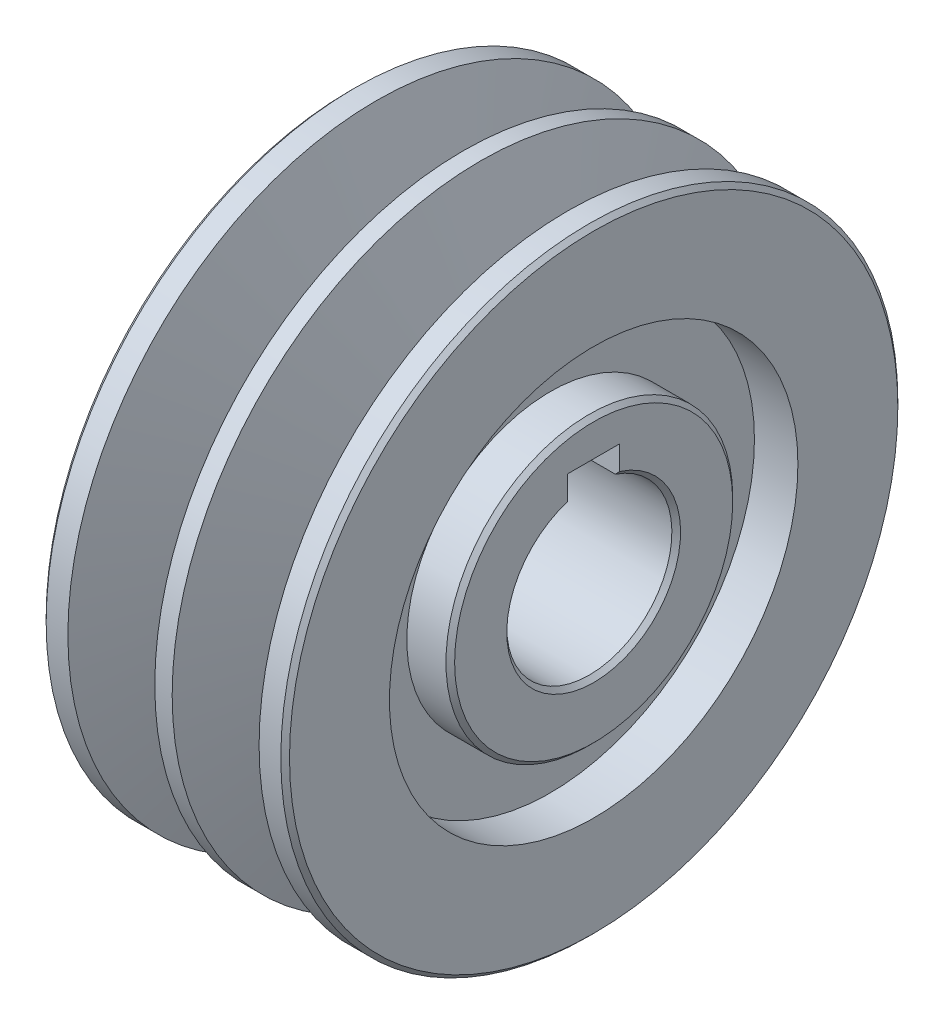
ISO-10303-21;
HEADER;
FILE_DESCRIPTION(('STEP AP214'),'2;1');
FILE_NAME('part.step','',(''),(''),'','','');
FILE_SCHEMA(('AUTOMOTIVE_DESIGN { 1 0 10303 214 1 1 1 1 }'));
ENDSEC;
DATA;
#1=APPLICATION_CONTEXT('core data for automotive mechanical design processes');
#2=APPLICATION_PROTOCOL_DEFINITION('international standard','automotive_design',2000,#1);
#3=PRODUCT_CONTEXT('',#1,'mechanical');
#4=PRODUCT('Part','Part','',(#3));
#5=PRODUCT_RELATED_PRODUCT_CATEGORY('part','',(#4));
#6=PRODUCT_DEFINITION_FORMATION('','',#4);
#7=PRODUCT_DEFINITION_CONTEXT('part definition',#1,'design');
#8=PRODUCT_DEFINITION('design','',#6,#7);
#9=PRODUCT_DEFINITION_SHAPE('','',#8);
#10=(LENGTH_UNIT() NAMED_UNIT(*) SI_UNIT(.MILLI.,.METRE.));
#11=(NAMED_UNIT(*) PLANE_ANGLE_UNIT() SI_UNIT($,.RADIAN.));
#12=(NAMED_UNIT(*) SI_UNIT($,.STERADIAN.) SOLID_ANGLE_UNIT());
#13=UNCERTAINTY_MEASURE_WITH_UNIT(LENGTH_MEASURE(1.E-05),#10,'distance_accuracy_value','');
#14=(GEOMETRIC_REPRESENTATION_CONTEXT(3) GLOBAL_UNCERTAINTY_ASSIGNED_CONTEXT((#13)) GLOBAL_UNIT_ASSIGNED_CONTEXT((#10,
#11,#12)) REPRESENTATION_CONTEXT('',''));
#15=CARTESIAN_POINT('',(0.,0.,0.));
#16=DIRECTION('',(0.,0.,1.));
#17=DIRECTION('',(1.,0.,0.));
#18=AXIS2_PLACEMENT_3D('',#15,#16,#17);
#19=CARTESIAN_POINT('',(0.,0.,0.));
#20=DIRECTION('',(1.,0.,0.));
#21=DIRECTION('',(0.,0.,-1.));
#22=AXIS2_PLACEMENT_3D('',#19,#20,#21);
#23=CYLINDRICAL_SURFACE('',#22,35.5);
#24=CARTESIAN_POINT('',(-13.5,0.,0.));
#25=DIRECTION('',(-1.,0.,0.));
#26=DIRECTION('',(0.,0.,1.));
#27=AXIS2_PLACEMENT_3D('',#24,#25,#26);
#28=CIRCLE('',#27,35.5);
#29=CARTESIAN_POINT('',(-13.5,0.,35.5));
#30=VERTEX_POINT('',#29);
#31=EDGE_CURVE('E341',#30,#30,#28,.F.);
#32=ORIENTED_EDGE('',*,*,#31,.T.);
#33=EDGE_LOOP('',(#32));
#34=FACE_BOUND('',#33,.T.);
#35=CARTESIAN_POINT('',(-11.,0.,0.));
#36=DIRECTION('',(1.,0.,0.));
#37=DIRECTION('',(0.,0.,-1.));
#38=AXIS2_PLACEMENT_3D('',#35,#36,#37);
#39=CIRCLE('',#38,35.5);
#40=CARTESIAN_POINT('',(-11.,0.,-35.5));
#41=VERTEX_POINT('',#40);
#42=EDGE_CURVE('E628',#41,#41,#39,.T.);
#43=ORIENTED_EDGE('',*,*,#42,.F.);
#44=EDGE_LOOP('',(#43));
#45=FACE_BOUND('',#44,.T.);
#46=ADVANCED_FACE('F41',(#34,#45),#23,.T.);
#47=CARTESIAN_POINT('',(-7.94269318541343,0.,0.));
#48=DIRECTION('',(-1.,0.,0.));
#49=DIRECTION('',(0.,0.,1.));
#50=AXIS2_PLACEMENT_3D('',#47,#48,#49);
#51=CONICAL_SURFACE('',#50,25.5,1.27409035395586);
#52=ORIENTED_EDGE('',*,*,#42,.T.);
#53=EDGE_LOOP('',(#52));
#54=FACE_BOUND('',#53,.T.);
#55=CARTESIAN_POINT('',(-7.94269318541343,0.,0.));
#56=DIRECTION('',(1.,0.,0.));
#57=DIRECTION('',(0.,0.,-1.));
#58=AXIS2_PLACEMENT_3D('',#55,#56,#57);
#59=CIRCLE('',#58,25.5);
#60=CARTESIAN_POINT('',(-7.94269318541343,0.,-25.5));
#61=VERTEX_POINT('',#60);
#62=EDGE_CURVE('E624',#61,#61,#59,.T.);
#63=ORIENTED_EDGE('',*,*,#62,.F.);
#64=EDGE_LOOP('',(#63));
#65=FACE_BOUND('',#64,.T.);
#66=ADVANCED_FACE('F209',(#54,#65),#51,.T.);
#67=CARTESIAN_POINT('',(0.,0.,0.));
#68=DIRECTION('',(1.,0.,0.));
#69=DIRECTION('',(0.,0.,-1.));
#70=AXIS2_PLACEMENT_3D('',#67,#68,#69);
#71=CYLINDRICAL_SURFACE('',#70,25.5);
#72=ORIENTED_EDGE('',*,*,#62,.T.);
#73=EDGE_LOOP('',(#72));
#74=FACE_BOUND('',#73,.T.);
#75=CARTESIAN_POINT('',(-4.05730681458657,0.,0.));
#76=DIRECTION('',(1.,0.,0.));
#77=DIRECTION('',(0.,0.,-1.));
#78=AXIS2_PLACEMENT_3D('',#75,#76,#77);
#79=CIRCLE('',#78,25.5);
#80=CARTESIAN_POINT('',(-4.05730681458657,0.,-25.5));
#81=VERTEX_POINT('',#80);
#82=EDGE_CURVE('E620',#81,#81,#79,.T.);
#83=ORIENTED_EDGE('',*,*,#82,.F.);
#84=EDGE_LOOP('',(#83));
#85=FACE_BOUND('',#84,.T.);
#86=ADVANCED_FACE('F214',(#74,#85),#71,.T.);
#87=CARTESIAN_POINT('',(-1.,0.,0.));
#88=DIRECTION('',(1.,0.,0.));
#89=DIRECTION('',(0.,0.,-1.));
#90=AXIS2_PLACEMENT_3D('',#87,#88,#89);
#91=CONICAL_SURFACE('',#90,35.5,1.27409035395586);
#92=ORIENTED_EDGE('',*,*,#82,.T.);
#93=EDGE_LOOP('',(#92));
#94=FACE_BOUND('',#93,.T.);
#95=CARTESIAN_POINT('',(-1.,0.,0.));
#96=DIRECTION('',(1.,0.,0.));
#97=DIRECTION('',(0.,0.,-1.));
#98=AXIS2_PLACEMENT_3D('',#95,#96,#97);
#99=CIRCLE('',#98,35.5);
#100=CARTESIAN_POINT('',(-1.,0.,-35.5));
#101=VERTEX_POINT('',#100);
#102=EDGE_CURVE('E616',#101,#101,#99,.T.);
#103=ORIENTED_EDGE('',*,*,#102,.F.);
#104=EDGE_LOOP('',(#103));
#105=FACE_BOUND('',#104,.T.);
#106=ADVANCED_FACE('F222',(#94,#105),#91,.T.);
#107=CARTESIAN_POINT('',(0.,0.,0.));
#108=DIRECTION('',(1.,0.,0.));
#109=DIRECTION('',(0.,0.,-1.));
#110=AXIS2_PLACEMENT_3D('',#107,#108,#109);
#111=CYLINDRICAL_SURFACE('',#110,35.5);
#112=ORIENTED_EDGE('',*,*,#102,.T.);
#113=EDGE_LOOP('',(#112));
#114=FACE_BOUND('',#113,.T.);
#115=CARTESIAN_POINT('',(1.,0.,0.));
#116=DIRECTION('',(1.,0.,0.));
#117=DIRECTION('',(0.,0.,-1.));
#118=AXIS2_PLACEMENT_3D('',#115,#116,#117);
#119=CIRCLE('',#118,35.5);
#120=CARTESIAN_POINT('',(1.,0.,-35.5));
#121=VERTEX_POINT('',#120);
#122=EDGE_CURVE('E612',#121,#121,#119,.T.);
#123=ORIENTED_EDGE('',*,*,#122,.F.);
#124=EDGE_LOOP('',(#123));
#125=FACE_BOUND('',#124,.T.);
#126=ADVANCED_FACE('F226',(#114,#125),#111,.T.);
#127=CARTESIAN_POINT('',(4.05730681458657,0.,0.));
#128=DIRECTION('',(-1.,0.,0.));
#129=DIRECTION('',(0.,0.,1.));
#130=AXIS2_PLACEMENT_3D('',#127,#128,#129);
#131=CONICAL_SURFACE('',#130,25.5,1.27409035395586);
#132=ORIENTED_EDGE('',*,*,#122,.T.);
#133=EDGE_LOOP('',(#132));
#134=FACE_BOUND('',#133,.T.);
#135=CARTESIAN_POINT('',(4.05730681458657,0.,0.));
#136=DIRECTION('',(1.,0.,0.));
#137=DIRECTION('',(0.,0.,-1.));
#138=AXIS2_PLACEMENT_3D('',#135,#136,#137);
#139=CIRCLE('',#138,25.5);
#140=CARTESIAN_POINT('',(4.05730681458657,0.,-25.5));
#141=VERTEX_POINT('',#140);
#142=EDGE_CURVE('E608',#141,#141,#139,.T.);
#143=ORIENTED_EDGE('',*,*,#142,.F.);
#144=EDGE_LOOP('',(#143));
#145=FACE_BOUND('',#144,.T.);
#146=ADVANCED_FACE('F230',(#134,#145),#131,.T.);
#147=CARTESIAN_POINT('',(0.,0.,0.));
#148=DIRECTION('',(1.,0.,0.));
#149=DIRECTION('',(0.,0.,-1.));
#150=AXIS2_PLACEMENT_3D('',#147,#148,#149);
#151=CYLINDRICAL_SURFACE('',#150,25.5);
#152=ORIENTED_EDGE('',*,*,#142,.T.);
#153=EDGE_LOOP('',(#152));
#154=FACE_BOUND('',#153,.T.);
#155=CARTESIAN_POINT('',(7.94269318541343,0.,0.));
#156=DIRECTION('',(1.,0.,0.));
#157=DIRECTION('',(0.,0.,-1.));
#158=AXIS2_PLACEMENT_3D('',#155,#156,#157);
#159=CIRCLE('',#158,25.5);
#160=CARTESIAN_POINT('',(7.94269318541343,0.,-25.5));
#161=VERTEX_POINT('',#160);
#162=EDGE_CURVE('E601',#161,#161,#159,.T.);
#163=ORIENTED_EDGE('',*,*,#162,.F.);
#164=EDGE_LOOP('',(#163));
#165=FACE_BOUND('',#164,.T.);
#166=ADVANCED_FACE('F234',(#154,#165),#151,.T.);
#167=CARTESIAN_POINT('',(11.,0.,0.));
#168=DIRECTION('',(1.,0.,0.));
#169=DIRECTION('',(0.,0.,-1.));
#170=AXIS2_PLACEMENT_3D('',#167,#168,#169);
#171=CONICAL_SURFACE('',#170,35.5,1.27409035395586);
#172=ORIENTED_EDGE('',*,*,#162,.T.);
#173=EDGE_LOOP('',(#172));
#174=FACE_BOUND('',#173,.T.);
#175=CARTESIAN_POINT('',(11.,0.,0.));
#176=DIRECTION('',(1.,0.,0.));
#177=DIRECTION('',(0.,0.,-1.));
#178=AXIS2_PLACEMENT_3D('',#175,#176,#177);
#179=CIRCLE('',#178,35.5);
#180=CARTESIAN_POINT('',(11.,0.,-35.5));
#181=VERTEX_POINT('',#180);
#182=EDGE_CURVE('E596',#181,#181,#179,.T.);
#183=ORIENTED_EDGE('',*,*,#182,.F.);
#184=EDGE_LOOP('',(#183));
#185=FACE_BOUND('',#184,.T.);
#186=ADVANCED_FACE('F238',(#174,#185),#171,.T.);
#187=CARTESIAN_POINT('',(0.,0.,0.));
#188=DIRECTION('',(1.,0.,0.));
#189=DIRECTION('',(0.,0.,-1.));
#190=AXIS2_PLACEMENT_3D('',#187,#188,#189);
#191=CYLINDRICAL_SURFACE('',#190,35.5);
#192=CARTESIAN_POINT('',(13.5,0.,0.));
#193=DIRECTION('',(1.,0.,0.));
#194=DIRECTION('',(0.,0.,-1.));
#195=AXIS2_PLACEMENT_3D('',#192,#193,#194);
#196=CIRCLE('',#195,35.5);
#197=CARTESIAN_POINT('',(13.5,0.,-35.5));
#198=VERTEX_POINT('',#197);
#199=EDGE_CURVE('E323',#198,#198,#196,.F.);
#200=ORIENTED_EDGE('',*,*,#199,.T.);
#201=EDGE_LOOP('',(#200));
#202=FACE_BOUND('',#201,.T.);
#203=ORIENTED_EDGE('',*,*,#182,.T.);
#204=EDGE_LOOP('',(#203));
#205=FACE_BOUND('',#204,.T.);
#206=ADVANCED_FACE('F242',(#202,#205),#191,.T.);
#207=CARTESIAN_POINT('',(14.,0.,-35.5));
#208=DIRECTION('',(1.,0.,0.));
#209=DIRECTION('',(0.,0.,-1.));
#210=AXIS2_PLACEMENT_3D('',#207,#208,#209);
#211=PLANE('',#210);
#212=CARTESIAN_POINT('',(14.,0.,0.));
#213=DIRECTION('',(1.,0.,0.));
#214=DIRECTION('',(0.,0.,-1.));
#215=AXIS2_PLACEMENT_3D('',#212,#213,#214);
#216=CIRCLE('',#215,35.);
#217=CARTESIAN_POINT('',(14.,0.,-35.));
#218=VERTEX_POINT('',#217);
#219=EDGE_CURVE('E330',#218,#218,#216,.T.);
#220=ORIENTED_EDGE('',*,*,#219,.T.);
#221=EDGE_LOOP('',(#220));
#222=FACE_BOUND('',#221,.T.);
#223=CARTESIAN_POINT('',(14.,0.,0.));
#224=DIRECTION('',(1.,0.,0.));
#225=DIRECTION('',(0.,0.,-1.));
#226=AXIS2_PLACEMENT_3D('',#223,#224,#225);
#227=CIRCLE('',#226,23.5);
#228=CARTESIAN_POINT('',(14.,0.,-23.5));
#229=VERTEX_POINT('',#228);
#230=EDGE_CURVE('E594',#229,#229,#227,.T.);
#231=ORIENTED_EDGE('',*,*,#230,.F.);
#232=EDGE_LOOP('',(#231));
#233=FACE_BOUND('',#232,.T.);
#234=ADVANCED_FACE('F246',(#222,#233),#211,.T.);
#235=CARTESIAN_POINT('',(0.,0.,0.));
#236=DIRECTION('',(1.,0.,0.));
#237=DIRECTION('',(0.,0.,-1.));
#238=AXIS2_PLACEMENT_3D('',#235,#236,#237);
#239=CYLINDRICAL_SURFACE('',#238,23.5);
#240=ORIENTED_EDGE('',*,*,#230,.T.);
#241=EDGE_LOOP('',(#240));
#242=FACE_BOUND('',#241,.T.);
#243=CARTESIAN_POINT('',(9.,0.,0.));
#244=DIRECTION('',(1.,0.,0.));
#245=DIRECTION('',(0.,0.,-1.));
#246=AXIS2_PLACEMENT_3D('',#243,#244,#245);
#247=CIRCLE('',#246,23.5);
#248=CARTESIAN_POINT('',(9.,0.,-23.5));
#249=VERTEX_POINT('',#248);
#250=EDGE_CURVE('E360',#249,#249,#247,.T.);
#251=ORIENTED_EDGE('',*,*,#250,.F.);
#252=EDGE_LOOP('',(#251));
#253=FACE_BOUND('',#252,.T.);
#254=ADVANCED_FACE('F250',(#242,#253),#239,.F.);
#255=CARTESIAN_POINT('',(9.,0.,-23.5));
#256=DIRECTION('',(1.,0.,0.));
#257=DIRECTION('',(0.,0.,-1.));
#258=AXIS2_PLACEMENT_3D('',#255,#256,#257);
#259=PLANE('',#258);
#260=ORIENTED_EDGE('',*,*,#250,.T.);
#261=EDGE_LOOP('',(#260));
#262=FACE_BOUND('',#261,.T.);
#263=CARTESIAN_POINT('',(9.,0.,0.));
#264=DIRECTION('',(1.,0.,0.));
#265=DIRECTION('',(0.,0.,-1.));
#266=AXIS2_PLACEMENT_3D('',#263,#264,#265);
#267=CIRCLE('',#266,16.5);
#268=CARTESIAN_POINT('',(9.,0.,-16.5));
#269=VERTEX_POINT('',#268);
#270=EDGE_CURVE('E357',#269,#269,#267,.T.);
#271=ORIENTED_EDGE('',*,*,#270,.F.);
#272=EDGE_LOOP('',(#271));
#273=FACE_BOUND('',#272,.T.);
#274=ADVANCED_FACE('F254',(#262,#273),#259,.T.);
#275=CARTESIAN_POINT('',(0.,0.,0.));
#276=DIRECTION('',(1.,0.,0.));
#277=DIRECTION('',(0.,0.,-1.));
#278=AXIS2_PLACEMENT_3D('',#275,#276,#277);
#279=CYLINDRICAL_SURFACE('',#278,16.5);
#280=CARTESIAN_POINT('',(13.5,0.,0.));
#281=DIRECTION('',(1.,0.,0.));
#282=DIRECTION('',(0.,0.,-1.));
#283=AXIS2_PLACEMENT_3D('',#280,#281,#282);
#284=CIRCLE('',#283,16.5);
#285=CARTESIAN_POINT('',(13.5,0.,-16.5));
#286=VERTEX_POINT('',#285);
#287=EDGE_CURVE('E577',#286,#286,#284,.F.);
#288=ORIENTED_EDGE('',*,*,#287,.T.);
#289=EDGE_LOOP('',(#288));
#290=FACE_BOUND('',#289,.T.);
#291=ORIENTED_EDGE('',*,*,#270,.T.);
#292=EDGE_LOOP('',(#291));
#293=FACE_BOUND('',#292,.T.);
#294=ADVANCED_FACE('F258',(#290,#293),#279,.T.);
#295=CARTESIAN_POINT('',(14.,0.,-16.5));
#296=DIRECTION('',(1.,0.,0.));
#297=DIRECTION('',(0.,0.,-1.));
#298=AXIS2_PLACEMENT_3D('',#295,#296,#297);
#299=PLANE('',#298);
#300=DIRECTION('',(0.,-1.,0.));
#301=VECTOR('',#300,1.);
#302=CARTESIAN_POINT('',(14.,12.3,3.));
#303=LINE('',#302,#301);
#304=CARTESIAN_POINT('',(14.,12.3,3.));
#305=VERTEX_POINT('',#304);
#306=CARTESIAN_POINT('',(14.,9.53939201416943,3.));
#307=VERTEX_POINT('',#306);
#308=EDGE_CURVE('E124',#305,#307,#303,.T.);
#309=ORIENTED_EDGE('',*,*,#308,.F.);
#310=DIRECTION('',(0.,0.,1.));
#311=VECTOR('',#310,1.);
#312=CARTESIAN_POINT('',(14.,12.3,3.));
#313=LINE('',#312,#311);
#314=CARTESIAN_POINT('',(14.,12.3,-3.));
#315=VERTEX_POINT('',#314);
#316=EDGE_CURVE('E127',#315,#305,#313,.T.);
#317=ORIENTED_EDGE('',*,*,#316,.F.);
#318=DIRECTION('',(0.,1.,0.));
#319=VECTOR('',#318,1.);
#320=CARTESIAN_POINT('',(14.,12.3,-3.));
#321=LINE('',#320,#319);
#322=CARTESIAN_POINT('',(14.,9.53939201416943,-3.));
#323=VERTEX_POINT('',#322);
#324=EDGE_CURVE('E102',#323,#315,#321,.T.);
#325=ORIENTED_EDGE('',*,*,#324,.F.);
#326=CARTESIAN_POINT('',(14.,0.,0.));
#327=DIRECTION('',(1.,0.,0.));
#328=DIRECTION('',(0.,0.,-1.));
#329=AXIS2_PLACEMENT_3D('',#326,#327,#328);
#330=CIRCLE('',#329,9.99999999999998);
#331=EDGE_CURVE('E572',#323,#307,#330,.F.);
#332=ORIENTED_EDGE('',*,*,#331,.T.);
#333=EDGE_LOOP('',(#309,#317,#325,#332));
#334=FACE_BOUND('',#333,.T.);
#335=CARTESIAN_POINT('',(14.,0.,0.));
#336=DIRECTION('',(1.,0.,0.));
#337=DIRECTION('',(0.,0.,-1.));
#338=AXIS2_PLACEMENT_3D('',#335,#336,#337);
#339=CIRCLE('',#338,16.);
#340=CARTESIAN_POINT('',(14.,0.,-16.));
#341=VERTEX_POINT('',#340);
#342=EDGE_CURVE('E578',#341,#341,#339,.T.);
#343=ORIENTED_EDGE('',*,*,#342,.T.);
#344=EDGE_LOOP('',(#343));
#345=FACE_BOUND('',#344,.T.);
#346=ADVANCED_FACE('F262',(#334,#345),#299,.T.);
#347=CARTESIAN_POINT('',(0.,0.,0.));
#348=DIRECTION('',(1.,0.,0.));
#349=DIRECTION('',(0.,0.,-1.));
#350=AXIS2_PLACEMENT_3D('',#347,#348,#349);
#351=CYLINDRICAL_SURFACE('',#350,9.5);
#352=DIRECTION('',(1.,0.,0.));
#353=VECTOR('',#352,1.);
#354=CARTESIAN_POINT('',(0.,9.01387818865997,3.));
#355=LINE('',#354,#353);
#356=CARTESIAN_POINT('',(13.5,9.01387818865997,3.));
#357=VERTEX_POINT('',#356);
#358=CARTESIAN_POINT('',(-13.5,9.01387818865997,3.));
#359=VERTEX_POINT('',#358);
#360=EDGE_CURVE('E150',#357,#359,#355,.F.);
#361=ORIENTED_EDGE('',*,*,#360,.F.);
#362=CARTESIAN_POINT('',(13.5,0.,0.));
#363=DIRECTION('',(1.,0.,0.));
#364=DIRECTION('',(0.,0.,-1.));
#365=AXIS2_PLACEMENT_3D('',#362,#363,#364);
#366=CIRCLE('',#365,9.5);
#367=CARTESIAN_POINT('',(13.5,9.01387818865997,-3.));
#368=VERTEX_POINT('',#367);
#369=EDGE_CURVE('E573',#357,#368,#366,.T.);
#370=ORIENTED_EDGE('',*,*,#369,.T.);
#371=DIRECTION('',(1.,0.,0.));
#372=VECTOR('',#371,1.);
#373=CARTESIAN_POINT('',(0.,9.01387818865997,-3.));
#374=LINE('',#373,#372);
#375=CARTESIAN_POINT('',(-13.5,9.01387818865997,-3.));
#376=VERTEX_POINT('',#375);
#377=EDGE_CURVE('E137',#376,#368,#374,.T.);
#378=ORIENTED_EDGE('',*,*,#377,.F.);
#379=CARTESIAN_POINT('',(-13.5,0.,0.));
#380=DIRECTION('',(-1.,0.,0.));
#381=DIRECTION('',(0.,0.,1.));
#382=AXIS2_PLACEMENT_3D('',#379,#380,#381);
#383=CIRCLE('',#382,9.5);
#384=EDGE_CURVE('E337',#376,#359,#383,.T.);
#385=ORIENTED_EDGE('',*,*,#384,.T.);
#386=EDGE_LOOP('',(#361,#370,#378,#385));
#387=FACE_BOUND('',#386,.T.);
#388=ADVANCED_FACE('F266',(#387),#351,.F.);
#389=CARTESIAN_POINT('',(-14.,0.,-9.5));
#390=DIRECTION('',(-1.,0.,0.));
#391=DIRECTION('',(0.,0.,1.));
#392=AXIS2_PLACEMENT_3D('',#389,#390,#391);
#393=PLANE('',#392);
#394=DIRECTION('',(0.,-1.,0.));
#395=VECTOR('',#394,1.);
#396=CARTESIAN_POINT('',(-14.,12.3,3.));
#397=LINE('',#396,#395);
#398=CARTESIAN_POINT('',(-14.,12.3,3.));
#399=VERTEX_POINT('',#398);
#400=CARTESIAN_POINT('',(-14.,9.53939201416948,3.));
#401=VERTEX_POINT('',#400);
#402=EDGE_CURVE('E108',#399,#401,#397,.T.);
#403=ORIENTED_EDGE('',*,*,#402,.T.);
#404=CARTESIAN_POINT('',(-14.,0.,0.));
#405=DIRECTION('',(-1.,0.,0.));
#406=DIRECTION('',(0.,0.,1.));
#407=AXIS2_PLACEMENT_3D('',#404,#405,#406);
#408=CIRCLE('',#407,10.);
#409=CARTESIAN_POINT('',(-14.,9.53939201416948,-3.));
#410=VERTEX_POINT('',#409);
#411=EDGE_CURVE('E122',#401,#410,#408,.F.);
#412=ORIENTED_EDGE('',*,*,#411,.T.);
#413=DIRECTION('',(0.,1.,0.));
#414=VECTOR('',#413,1.);
#415=CARTESIAN_POINT('',(-14.,7.43298087794207,-3.));
#416=LINE('',#415,#414);
#417=CARTESIAN_POINT('',(-14.,12.3,-3.));
#418=VERTEX_POINT('',#417);
#419=EDGE_CURVE('E63',#410,#418,#416,.T.);
#420=ORIENTED_EDGE('',*,*,#419,.T.);
#421=DIRECTION('',(0.,0.,1.));
#422=VECTOR('',#421,1.);
#423=CARTESIAN_POINT('',(-14.,12.3,3.));
#424=LINE('',#423,#422);
#425=EDGE_CURVE('E111',#418,#399,#424,.T.);
#426=ORIENTED_EDGE('',*,*,#425,.T.);
#427=EDGE_LOOP('',(#403,#412,#420,#426));
#428=FACE_BOUND('',#427,.T.);
#429=CARTESIAN_POINT('',(-14.,0.,0.));
#430=DIRECTION('',(-1.,0.,0.));
#431=DIRECTION('',(0.,0.,1.));
#432=AXIS2_PLACEMENT_3D('',#429,#430,#431);
#433=CIRCLE('',#432,16.);
#434=CARTESIAN_POINT('',(-14.,0.,16.));
#435=VERTEX_POINT('',#434);
#436=EDGE_CURVE('E327',#435,#435,#433,.T.);
#437=ORIENTED_EDGE('',*,*,#436,.T.);
#438=EDGE_LOOP('',(#437));
#439=FACE_BOUND('',#438,.T.);
#440=ADVANCED_FACE('F119',(#428,#439),#393,.T.);
#441=CARTESIAN_POINT('',(0.,0.,0.));
#442=DIRECTION('',(1.,0.,0.));
#443=DIRECTION('',(0.,0.,-1.));
#444=AXIS2_PLACEMENT_3D('',#441,#442,#443);
#445=CYLINDRICAL_SURFACE('',#444,16.5);
#446=CARTESIAN_POINT('',(-10.,0.,0.));
#447=DIRECTION('',(-1.,0.,0.));
#448=DIRECTION('',(0.,0.,1.));
#449=AXIS2_PLACEMENT_3D('',#446,#447,#448);
#450=CIRCLE('',#449,16.5);
#451=CARTESIAN_POINT('',(-10.,0.,16.5));
#452=VERTEX_POINT('',#451);
#453=EDGE_CURVE('E170',#452,#452,#450,.T.);
#454=ORIENTED_EDGE('',*,*,#453,.T.);
#455=EDGE_LOOP('',(#454));
#456=FACE_BOUND('',#455,.T.);
#457=CARTESIAN_POINT('',(-13.5,0.,0.));
#458=DIRECTION('',(-1.,0.,0.));
#459=DIRECTION('',(0.,0.,1.));
#460=AXIS2_PLACEMENT_3D('',#457,#458,#459);
#461=CIRCLE('',#460,16.5);
#462=CARTESIAN_POINT('',(-13.5,0.,16.5));
#463=VERTEX_POINT('',#462);
#464=EDGE_CURVE('E320',#463,#463,#461,.F.);
#465=ORIENTED_EDGE('',*,*,#464,.T.);
#466=EDGE_LOOP('',(#465));
#467=FACE_BOUND('',#466,.T.);
#468=ADVANCED_FACE('F273',(#456,#467),#445,.T.);
#469=CARTESIAN_POINT('',(-9.,0.,-16.5));
#470=DIRECTION('',(-1.,0.,0.));
#471=DIRECTION('',(0.,0.,1.));
#472=AXIS2_PLACEMENT_3D('',#469,#470,#471);
#473=PLANE('',#472);
#474=CARTESIAN_POINT('',(-9.,0.,0.));
#475=DIRECTION('',(-1.,0.,0.));
#476=DIRECTION('',(0.,0.,1.));
#477=AXIS2_PLACEMENT_3D('',#474,#475,#476);
#478=CIRCLE('',#477,22.5);
#479=CARTESIAN_POINT('',(-9.,0.,22.5));
#480=VERTEX_POINT('',#479);
#481=EDGE_CURVE('E308',#480,#480,#478,.T.);
#482=ORIENTED_EDGE('',*,*,#481,.T.);
#483=EDGE_LOOP('',(#482));
#484=FACE_BOUND('',#483,.T.);
#485=CARTESIAN_POINT('',(-9.,0.,0.));
#486=DIRECTION('',(-1.,0.,0.));
#487=DIRECTION('',(0.,0.,1.));
#488=AXIS2_PLACEMENT_3D('',#485,#486,#487);
#489=CIRCLE('',#488,17.5);
#490=CARTESIAN_POINT('',(-9.,0.,17.5));
#491=VERTEX_POINT('',#490);
#492=EDGE_CURVE('E299',#491,#491,#489,.F.);
#493=ORIENTED_EDGE('',*,*,#492,.T.);
#494=EDGE_LOOP('',(#493));
#495=FACE_BOUND('',#494,.T.);
#496=ADVANCED_FACE('F276',(#484,#495),#473,.T.);
#497=CARTESIAN_POINT('',(0.,0.,0.));
#498=DIRECTION('',(1.,0.,0.));
#499=DIRECTION('',(0.,0.,-1.));
#500=AXIS2_PLACEMENT_3D('',#497,#498,#499);
#501=CYLINDRICAL_SURFACE('',#500,23.5);
#502=CARTESIAN_POINT('',(-10.,0.,0.));
#503=DIRECTION('',(-1.,0.,0.));
#504=DIRECTION('',(0.,0.,1.));
#505=AXIS2_PLACEMENT_3D('',#502,#503,#504);
#506=CIRCLE('',#505,23.5);
#507=CARTESIAN_POINT('',(-10.,0.,23.5));
#508=VERTEX_POINT('',#507);
#509=EDGE_CURVE('E290',#508,#508,#506,.F.);
#510=ORIENTED_EDGE('',*,*,#509,.T.);
#511=EDGE_LOOP('',(#510));
#512=FACE_BOUND('',#511,.T.);
#513=CARTESIAN_POINT('',(-13.5,0.,0.));
#514=DIRECTION('',(-1.,0.,0.));
#515=DIRECTION('',(0.,0.,1.));
#516=AXIS2_PLACEMENT_3D('',#513,#514,#515);
#517=CIRCLE('',#516,23.5);
#518=CARTESIAN_POINT('',(-13.5,0.,23.5));
#519=VERTEX_POINT('',#518);
#520=EDGE_CURVE('E293',#519,#519,#517,.T.);
#521=ORIENTED_EDGE('',*,*,#520,.T.);
#522=EDGE_LOOP('',(#521));
#523=FACE_BOUND('',#522,.T.);
#524=ADVANCED_FACE('F279',(#512,#523),#501,.F.);
#525=CARTESIAN_POINT('',(-14.,0.,-35.5));
#526=DIRECTION('',(-1.,0.,0.));
#527=DIRECTION('',(0.,0.,1.));
#528=AXIS2_PLACEMENT_3D('',#525,#526,#527);
#529=PLANE('',#528);
#530=CARTESIAN_POINT('',(-14.,0.,0.));
#531=DIRECTION('',(-1.,0.,0.));
#532=DIRECTION('',(0.,0.,1.));
#533=AXIS2_PLACEMENT_3D('',#530,#531,#532);
#534=CIRCLE('',#533,35.);
#535=CARTESIAN_POINT('',(-14.,0.,35.));
#536=VERTEX_POINT('',#535);
#537=EDGE_CURVE('E295',#536,#536,#534,.T.);
#538=ORIENTED_EDGE('',*,*,#537,.T.);
#539=EDGE_LOOP('',(#538));
#540=FACE_BOUND('',#539,.T.);
#541=CARTESIAN_POINT('',(-14.,0.,0.));
#542=DIRECTION('',(-1.,0.,0.));
#543=DIRECTION('',(0.,0.,1.));
#544=AXIS2_PLACEMENT_3D('',#541,#542,#543);
#545=CIRCLE('',#544,24.);
#546=CARTESIAN_POINT('',(-14.,0.,24.));
#547=VERTEX_POINT('',#546);
#548=EDGE_CURVE('E302',#547,#547,#545,.F.);
#549=ORIENTED_EDGE('',*,*,#548,.T.);
#550=EDGE_LOOP('',(#549));
#551=FACE_BOUND('',#550,.T.);
#552=ADVANCED_FACE('F161',(#540,#551),#529,.T.);
#553=CARTESIAN_POINT('',(13.5,0.,0.));
#554=DIRECTION('',(1.,0.,0.));
#555=DIRECTION('',(0.,0.,-1.));
#556=AXIS2_PLACEMENT_3D('',#553,#554,#555);
#557=CONICAL_SURFACE('',#556,9.5,0.785398163397429);
#558=CARTESIAN_POINT('',(16.6154604407613,12.2535644664077,3.));
#559=CARTESIAN_POINT('',(16.3733723666181,12.004323485741,3.));
#560=CARTESIAN_POINT('',(16.1314952465939,11.7548779371056,3.));
#561=CARTESIAN_POINT('',(15.6482603058921,11.2554843837296,3.));
#562=CARTESIAN_POINT('',(15.4069024852408,11.0055363789635,3.));
#563=CARTESIAN_POINT('',(14.6837905037315,10.2548365350653,3.));
#564=CARTESIAN_POINT('',(14.2029612291103,9.75319124935251,3.));
#565=CARTESIAN_POINT('',(13.4845860226208,8.99796166320799,3.));
#566=CARTESIAN_POINT('',(13.2455977314413,8.74574964438044,3.));
#567=CARTESIAN_POINT('',(12.7688667193426,8.24015420115851,3.));
#568=CARTESIAN_POINT('',(12.5311239882669,7.98677078634773,3.));
#569=CARTESIAN_POINT('',(12.0572388278039,7.4784735027146,3.));
#570=CARTESIAN_POINT('',(11.8210965207733,7.2235595196243,3.));
#571=CARTESIAN_POINT('',(11.4685147815183,6.83968309104933,3.));
#572=CARTESIAN_POINT('',(11.3512578648633,6.71147157411063,3.));
#573=CARTESIAN_POINT('',(11.1173892873714,6.45445985575204,3.));
#574=CARTESIAN_POINT('',(11.0007776311638,6.32565965012083,3.));
#575=CARTESIAN_POINT('',(10.8845395592387,6.19652200373114,3.));
#576=B_SPLINE_CURVE_WITH_KNOTS('',3,(#558,#559,#560,#561,#562,#563,#564,#565,#566,#567,#568,
#569,#570,#571,#572,#573,#574,#575),.UNSPECIFIED.,.F.,.F.,(4,2,2,2,2,2,2,2,4),(0.,
1.04237601534942,2.08475208353532,4.16934678025917,5.21171439559541,6.25407349799201,
7.2965114123713,7.81774490710185,8.33898213645327),.UNSPECIFIED.);
#577=EDGE_CURVE('E71',#307,#357,#576,.T.);
#578=ORIENTED_EDGE('',*,*,#577,.F.);
#579=ORIENTED_EDGE('',*,*,#331,.F.);
#580=CARTESIAN_POINT('',(10.8845395592387,6.19652200373113,-3.));
#581=CARTESIAN_POINT('',(11.0007776311637,6.32565965012083,-3.));
#582=CARTESIAN_POINT('',(11.1173892873714,6.45445985575203,-3.));
#583=CARTESIAN_POINT('',(11.3512578648633,6.71147157411062,-3.));
#584=CARTESIAN_POINT('',(11.4685147815183,6.83968309104933,-3.));
#585=CARTESIAN_POINT('',(11.8210965207733,7.2235595196243,-3.));
#586=CARTESIAN_POINT('',(12.0572388278039,7.47847350271459,-3.));
#587=CARTESIAN_POINT('',(12.5311239882669,7.98677078634772,-3.));
#588=CARTESIAN_POINT('',(12.7688667193426,8.2401542011585,-3.));
#589=CARTESIAN_POINT('',(13.2455977314413,8.74574964438044,-3.));
#590=CARTESIAN_POINT('',(13.4845860226208,8.99796166320798,-3.));
#591=CARTESIAN_POINT('',(14.2029612291103,9.75319124935251,-3.));
#592=CARTESIAN_POINT('',(14.6837905037315,10.2548365350653,-3.));
#593=CARTESIAN_POINT('',(15.4069024852408,11.0055363789635,-3.));
#594=CARTESIAN_POINT('',(15.6482603058921,11.2554843837296,-3.));
#595=CARTESIAN_POINT('',(16.1314952465939,11.7548779371056,-3.));
#596=CARTESIAN_POINT('',(16.3733723666181,12.004323485741,-3.));
#597=CARTESIAN_POINT('',(16.6154604407613,12.2535644664077,-3.));
#598=B_SPLINE_CURVE_WITH_KNOTS('',3,(#580,#581,#582,#583,#584,#585,#586,#587,#588,#589,#590,
#591,#592,#593,#594,#595,#596,#597),.UNSPECIFIED.,.F.,.F.,(4,2,2,2,2,2,2,2,4),(0.,
0.521237229351425,1.04247072408197,2.08490863846127,3.12726774085787,4.16963535619412,
6.25423005291796,7.29660612110387,8.33898213645328),.UNSPECIFIED.);
#599=EDGE_CURVE('E141',#368,#323,#598,.T.);
#600=ORIENTED_EDGE('',*,*,#599,.F.);
#601=ORIENTED_EDGE('',*,*,#369,.F.);
#602=EDGE_LOOP('',(#578,#579,#600,#601));
#603=FACE_BOUND('',#602,.T.);
#604=ADVANCED_FACE('F153',(#603),#557,.F.);
#605=CARTESIAN_POINT('',(14.,0.,0.));
#606=DIRECTION('',(-1.,0.,0.));
#607=DIRECTION('',(0.,0.,1.));
#608=AXIS2_PLACEMENT_3D('',#605,#606,#607);
#609=CONICAL_SURFACE('',#608,16.,0.785398163397445);
#610=ORIENTED_EDGE('',*,*,#287,.F.);
#611=EDGE_LOOP('',(#610));
#612=FACE_BOUND('',#611,.T.);
#613=ORIENTED_EDGE('',*,*,#342,.F.);
#614=EDGE_LOOP('',(#613));
#615=FACE_BOUND('',#614,.T.);
#616=ADVANCED_FACE('F434',(#612,#615),#609,.T.);
#617=CARTESIAN_POINT('',(14.,0.,0.));
#618=DIRECTION('',(-1.,0.,0.));
#619=DIRECTION('',(0.,0.,1.));
#620=AXIS2_PLACEMENT_3D('',#617,#618,#619);
#621=CONICAL_SURFACE('',#620,35.,0.785398163397448);
#622=ORIENTED_EDGE('',*,*,#199,.F.);
#623=EDGE_LOOP('',(#622));
#624=FACE_BOUND('',#623,.T.);
#625=ORIENTED_EDGE('',*,*,#219,.F.);
#626=EDGE_LOOP('',(#625));
#627=FACE_BOUND('',#626,.T.);
#628=ADVANCED_FACE('F425',(#624,#627),#621,.T.);
#629=CARTESIAN_POINT('',(-13.5,0.,0.));
#630=DIRECTION('',(1.,0.,0.));
#631=DIRECTION('',(0.,0.,-1.));
#632=AXIS2_PLACEMENT_3D('',#629,#630,#631);
#633=CONICAL_SURFACE('',#632,16.5,0.785398163397441);
#634=ORIENTED_EDGE('',*,*,#436,.F.);
#635=EDGE_LOOP('',(#634));
#636=FACE_BOUND('',#635,.T.);
#637=ORIENTED_EDGE('',*,*,#464,.F.);
#638=EDGE_LOOP('',(#637));
#639=FACE_BOUND('',#638,.T.);
#640=ADVANCED_FACE('F183',(#636,#639),#633,.T.);
#641=CARTESIAN_POINT('',(-14.,0.,0.));
#642=DIRECTION('',(-1.,0.,0.));
#643=DIRECTION('',(0.,0.,1.));
#644=AXIS2_PLACEMENT_3D('',#641,#642,#643);
#645=CONICAL_SURFACE('',#644,10.,0.785398163397453);
#646=CARTESIAN_POINT('',(-10.8845395592387,6.19652200373095,3.));
#647=CARTESIAN_POINT('',(-11.0007776311637,6.32565965012066,3.));
#648=CARTESIAN_POINT('',(-11.1173892873714,6.45445985575187,3.));
#649=CARTESIAN_POINT('',(-11.3512578648632,6.71147157411048,3.));
#650=CARTESIAN_POINT('',(-11.4685147815182,6.83968309104919,3.));
#651=CARTESIAN_POINT('',(-11.8210965207733,7.22355951962419,3.));
#652=CARTESIAN_POINT('',(-12.0572388278038,7.47847350271449,3.));
#653=CARTESIAN_POINT('',(-12.5311239882669,7.98677078634766,3.));
#654=CARTESIAN_POINT('',(-12.7688667193426,8.24015420115846,3.));
#655=CARTESIAN_POINT('',(-13.2455977314413,8.74574964438043,3.));
#656=CARTESIAN_POINT('',(-13.4845860226207,8.99796166320799,3.));
#657=CARTESIAN_POINT('',(-14.2029612291103,9.75319124935257,3.));
#658=CARTESIAN_POINT('',(-14.6837905037315,10.2548365350654,3.));
#659=CARTESIAN_POINT('',(-15.4069024852409,11.0055363789636,3.));
#660=CARTESIAN_POINT('',(-15.6482603058921,11.2554843837297,3.));
#661=CARTESIAN_POINT('',(-16.1314952465939,11.7548779371058,3.));
#662=CARTESIAN_POINT('',(-16.3733723666182,12.0043234857412,3.));
#663=CARTESIAN_POINT('',(-16.6154604407613,12.253564466408,3.));
#664=B_SPLINE_CURVE_WITH_KNOTS('',3,(#646,#647,#648,#649,#650,#651,#652,#653,#654,#655,#656,
#657,#658,#659,#660,#661,#662,#663),.UNSPECIFIED.,.F.,.F.,(4,2,2,2,2,2,2,2,4),(0.,
0.521237229351449,1.04247072408202,2.08490863846136,3.127267740858,4.1696353561943,
6.25423005291823,7.29660612110419,8.33898213645365),.UNSPECIFIED.);
#665=EDGE_CURVE('E11',#359,#401,#664,.T.);
#666=ORIENTED_EDGE('',*,*,#665,.F.);
#667=ORIENTED_EDGE('',*,*,#384,.F.);
#668=CARTESIAN_POINT('',(-16.6154604407613,12.2535644664079,-3.));
#669=CARTESIAN_POINT('',(-16.3733723666182,12.0043234857412,-3.));
#670=CARTESIAN_POINT('',(-16.1314952465939,11.7548779371058,-3.));
#671=CARTESIAN_POINT('',(-15.6482603058921,11.2554843837297,-3.));
#672=CARTESIAN_POINT('',(-15.4069024852408,11.0055363789636,-3.));
#673=CARTESIAN_POINT('',(-14.6837905037315,10.2548365350654,-3.));
#674=CARTESIAN_POINT('',(-14.2029612291103,9.75319124935256,-3.));
#675=CARTESIAN_POINT('',(-13.4845860226207,8.99796166320798,-3.));
#676=CARTESIAN_POINT('',(-13.2455977314413,8.74574964438042,-3.));
#677=CARTESIAN_POINT('',(-12.7688667193426,8.24015420115845,-3.));
#678=CARTESIAN_POINT('',(-12.5311239882669,7.98677078634765,-3.));
#679=CARTESIAN_POINT('',(-12.0572388278038,7.47847350271449,-3.));
#680=CARTESIAN_POINT('',(-11.8210965207733,7.22355951962418,-3.));
#681=CARTESIAN_POINT('',(-11.4685147815182,6.83968309104918,-3.));
#682=CARTESIAN_POINT('',(-11.3512578648632,6.71147157411047,-3.));
#683=CARTESIAN_POINT('',(-11.1173892873714,6.45445985575186,-3.));
#684=CARTESIAN_POINT('',(-11.0007776311637,6.32565965012064,-3.));
#685=CARTESIAN_POINT('',(-10.8845395592386,6.19652200373094,-3.));
#686=B_SPLINE_CURVE_WITH_KNOTS('',3,(#668,#669,#670,#671,#672,#673,#674,#675,#676,#677,#678,
#679,#680,#681,#682,#683,#684,#685),.UNSPECIFIED.,.F.,.F.,(4,2,2,2,2,2,2,2,4),(0.,
1.04237601534946,2.08475208353542,4.16934678025935,5.21171439559565,6.25407349799229,
7.29651141237163,7.8177449071022,8.33898213645365),.UNSPECIFIED.);
#687=EDGE_CURVE('E56',#410,#376,#686,.T.);
#688=ORIENTED_EDGE('',*,*,#687,.F.);
#689=ORIENTED_EDGE('',*,*,#411,.F.);
#690=EDGE_LOOP('',(#666,#667,#688,#689));
#691=FACE_BOUND('',#690,.T.);
#692=ADVANCED_FACE('F173',(#691),#645,.F.);
#693=CARTESIAN_POINT('',(-13.5,0.,0.));
#694=DIRECTION('',(1.,0.,0.));
#695=DIRECTION('',(0.,0.,-1.));
#696=AXIS2_PLACEMENT_3D('',#693,#694,#695);
#697=CONICAL_SURFACE('',#696,35.5,0.785398163397448);
#698=ORIENTED_EDGE('',*,*,#537,.F.);
#699=EDGE_LOOP('',(#698));
#700=FACE_BOUND('',#699,.T.);
#701=ORIENTED_EDGE('',*,*,#31,.F.);
#702=EDGE_LOOP('',(#701));
#703=FACE_BOUND('',#702,.T.);
#704=ADVANCED_FACE('F182',(#700,#703),#697,.T.);
#705=CARTESIAN_POINT('',(-14.,0.,0.));
#706=DIRECTION('',(-1.,0.,0.));
#707=DIRECTION('',(0.,0.,1.));
#708=AXIS2_PLACEMENT_3D('',#705,#706,#707);
#709=CONICAL_SURFACE('',#708,24.,0.785398163397448);
#710=ORIENTED_EDGE('',*,*,#520,.F.);
#711=EDGE_LOOP('',(#710));
#712=FACE_BOUND('',#711,.T.);
#713=ORIENTED_EDGE('',*,*,#548,.F.);
#714=EDGE_LOOP('',(#713));
#715=FACE_BOUND('',#714,.T.);
#716=ADVANCED_FACE('F192',(#712,#715),#709,.F.);
#717=CARTESIAN_POINT('',(-10.,0.,0.));
#718=DIRECTION('',(-1.,0.,0.));
#719=DIRECTION('',(0.,0.,1.));
#720=AXIS2_PLACEMENT_3D('',#717,#718,#719);
#721=TOROIDAL_SURFACE('',#720,22.5,1.);
#722=ORIENTED_EDGE('',*,*,#481,.F.);
#723=EDGE_LOOP('',(#722));
#724=FACE_BOUND('',#723,.T.);
#725=ORIENTED_EDGE('',*,*,#509,.F.);
#726=EDGE_LOOP('',(#725));
#727=FACE_BOUND('',#726,.T.);
#728=ADVANCED_FACE('F197',(#724,#727),#721,.F.);
#729=CARTESIAN_POINT('',(-10.,0.,0.));
#730=DIRECTION('',(-1.,0.,0.));
#731=DIRECTION('',(0.,0.,1.));
#732=AXIS2_PLACEMENT_3D('',#729,#730,#731);
#733=TOROIDAL_SURFACE('',#732,17.5,1.);
#734=ORIENTED_EDGE('',*,*,#453,.F.);
#735=EDGE_LOOP('',(#734));
#736=FACE_BOUND('',#735,.T.);
#737=ORIENTED_EDGE('',*,*,#492,.F.);
#738=EDGE_LOOP('',(#737));
#739=FACE_BOUND('',#738,.T.);
#740=ADVANCED_FACE('F43',(#736,#739),#733,.F.);
#741=CARTESIAN_POINT('',(-14.,12.3,3.));
#742=DIRECTION('',(0.,0.,1.));
#743=DIRECTION('',(0.,-1.,0.));
#744=AXIS2_PLACEMENT_3D('',#741,#742,#743);
#745=PLANE('',#744);
#746=ORIENTED_EDGE('',*,*,#577,.T.);
#747=ORIENTED_EDGE('',*,*,#360,.T.);
#748=ORIENTED_EDGE('',*,*,#665,.T.);
#749=ORIENTED_EDGE('',*,*,#402,.F.);
#750=DIRECTION('',(1.,0.,0.));
#751=VECTOR('',#750,1.);
#752=CARTESIAN_POINT('',(-14.,12.3,3.));
#753=LINE('',#752,#751);
#754=EDGE_CURVE('E107',#399,#305,#753,.T.);
#755=ORIENTED_EDGE('',*,*,#754,.T.);
#756=ORIENTED_EDGE('',*,*,#308,.T.);
#757=EDGE_LOOP('',(#746,#747,#748,#749,#755,#756));
#758=FACE_BOUND('',#757,.T.);
#759=ADVANCED_FACE('F204',(#758),#745,.F.);
#760=CARTESIAN_POINT('',(-14.,12.3,3.));
#761=DIRECTION('',(0.,1.,0.));
#762=DIRECTION('',(0.,0.,1.));
#763=AXIS2_PLACEMENT_3D('',#760,#761,#762);
#764=PLANE('',#763);
#765=ORIENTED_EDGE('',*,*,#316,.T.);
#766=ORIENTED_EDGE('',*,*,#754,.F.);
#767=ORIENTED_EDGE('',*,*,#425,.F.);
#768=DIRECTION('',(1.,0.,0.));
#769=VECTOR('',#768,1.);
#770=CARTESIAN_POINT('',(-14.,12.3,-3.));
#771=LINE('',#770,#769);
#772=EDGE_CURVE('E98',#418,#315,#771,.T.);
#773=ORIENTED_EDGE('',*,*,#772,.T.);
#774=EDGE_LOOP('',(#765,#766,#767,#773));
#775=FACE_BOUND('',#774,.T.);
#776=ADVANCED_FACE('F112',(#775),#764,.F.);
#777=CARTESIAN_POINT('',(-14.,12.3,-3.));
#778=DIRECTION('',(0.,0.,-1.));
#779=DIRECTION('',(0.,1.,0.));
#780=AXIS2_PLACEMENT_3D('',#777,#778,#779);
#781=PLANE('',#780);
#782=ORIENTED_EDGE('',*,*,#599,.T.);
#783=ORIENTED_EDGE('',*,*,#324,.T.);
#784=ORIENTED_EDGE('',*,*,#772,.F.);
#785=ORIENTED_EDGE('',*,*,#419,.F.);
#786=ORIENTED_EDGE('',*,*,#687,.T.);
#787=ORIENTED_EDGE('',*,*,#377,.T.);
#788=EDGE_LOOP('',(#782,#783,#784,#785,#786,#787));
#789=FACE_BOUND('',#788,.T.);
#790=ADVANCED_FACE('F100',(#789),#781,.F.);
#791=CLOSED_SHELL('',(#46,#66,#86,#106,#126,#146,#166,#186,#206,#234,#254,#274,#294,#346,#388,
#440,#468,#496,#524,#552,#604,#616,#628,#640,#692,#704,#716,#728,#740,#759,#776,#790));
#792=MANIFOLD_SOLID_BREP('B2',#791);
#793=ADVANCED_BREP_SHAPE_REPRESENTATION('',(#18,#792),#14);
#794=SHAPE_DEFINITION_REPRESENTATION(#9,#793);
ENDSEC;
END-ISO-10303-21;
